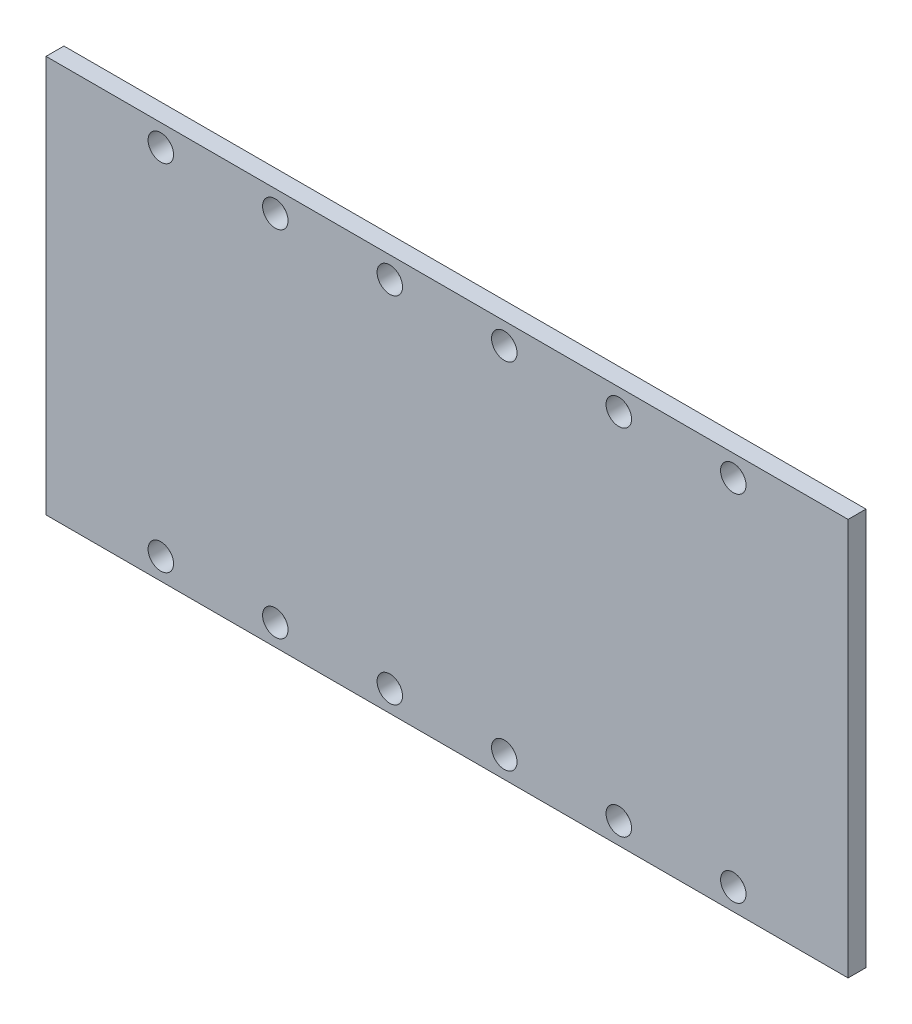
ISO-10303-21;
HEADER;
FILE_DESCRIPTION(('STEP AP214'),'2;1');
FILE_NAME('part.step','',(''),(''),'','','');
FILE_SCHEMA(('AUTOMOTIVE_DESIGN { 1 0 10303 214 1 1 1 1 }'));
ENDSEC;
DATA;
#1=APPLICATION_CONTEXT('core data for automotive mechanical design processes');
#2=APPLICATION_PROTOCOL_DEFINITION('international standard','automotive_design',2000,#1);
#3=PRODUCT_CONTEXT('',#1,'mechanical');
#4=PRODUCT('Part','Part','',(#3));
#5=PRODUCT_RELATED_PRODUCT_CATEGORY('part','',(#4));
#6=PRODUCT_DEFINITION_FORMATION('','',#4);
#7=PRODUCT_DEFINITION_CONTEXT('part definition',#1,'design');
#8=PRODUCT_DEFINITION('design','',#6,#7);
#9=PRODUCT_DEFINITION_SHAPE('','',#8);
#10=(LENGTH_UNIT() NAMED_UNIT(*) SI_UNIT(.MILLI.,.METRE.));
#11=(NAMED_UNIT(*) PLANE_ANGLE_UNIT() SI_UNIT($,.RADIAN.));
#12=(NAMED_UNIT(*) SI_UNIT($,.STERADIAN.) SOLID_ANGLE_UNIT());
#13=UNCERTAINTY_MEASURE_WITH_UNIT(LENGTH_MEASURE(1.E-05),#10,'distance_accuracy_value','');
#14=(GEOMETRIC_REPRESENTATION_CONTEXT(3) GLOBAL_UNCERTAINTY_ASSIGNED_CONTEXT((#13)) GLOBAL_UNIT_ASSIGNED_CONTEXT((#10,
#11,#12)) REPRESENTATION_CONTEXT('',''));
#15=CARTESIAN_POINT('',(0.,0.,0.));
#16=DIRECTION('',(0.,0.,1.));
#17=DIRECTION('',(1.,0.,0.));
#18=AXIS2_PLACEMENT_3D('',#15,#16,#17);
#19=CARTESIAN_POINT('',(35.5854,17.62125,1.5875));
#20=DIRECTION('',(0.,0.,-1.));
#21=DIRECTION('',(-1.,0.,0.));
#22=AXIS2_PLACEMENT_3D('',#19,#20,#21);
#23=PLANE('',#22);
#24=CARTESIAN_POINT('',(5.08,-15.71625,1.5875));
#25=DIRECTION('',(0.,0.,1.));
#26=DIRECTION('',(1.,0.,0.));
#27=AXIS2_PLACEMENT_3D('',#24,#25,#26);
#28=CIRCLE('',#27,1.1303);
#29=CARTESIAN_POINT('',(6.2103,-15.71625,1.5875));
#30=VERTEX_POINT('',#29);
#31=EDGE_CURVE('E169',#30,#30,#28,.T.);
#32=ORIENTED_EDGE('',*,*,#31,.F.);
#33=EDGE_LOOP('',(#32));
#34=FACE_BOUND('',#33,.T.);
#35=CARTESIAN_POINT('',(-15.24,-15.71625,1.5875));
#36=DIRECTION('',(0.,0.,1.));
#37=DIRECTION('',(1.,0.,0.));
#38=AXIS2_PLACEMENT_3D('',#35,#36,#37);
#39=CIRCLE('',#38,1.1303);
#40=CARTESIAN_POINT('',(-14.1097,-15.71625,1.5875));
#41=VERTEX_POINT('',#40);
#42=EDGE_CURVE('E161',#41,#41,#39,.T.);
#43=ORIENTED_EDGE('',*,*,#42,.F.);
#44=EDGE_LOOP('',(#43));
#45=FACE_BOUND('',#44,.T.);
#46=CARTESIAN_POINT('',(-25.4,-15.71625,1.5875));
#47=DIRECTION('',(0.,0.,1.));
#48=DIRECTION('',(1.,0.,0.));
#49=AXIS2_PLACEMENT_3D('',#46,#47,#48);
#50=CIRCLE('',#49,1.1303);
#51=CARTESIAN_POINT('',(-24.2697,-15.71625,1.5875));
#52=VERTEX_POINT('',#51);
#53=EDGE_CURVE('E157',#52,#52,#50,.T.);
#54=ORIENTED_EDGE('',*,*,#53,.F.);
#55=EDGE_LOOP('',(#54));
#56=FACE_BOUND('',#55,.T.);
#57=CARTESIAN_POINT('',(-15.24,15.71625,1.5875));
#58=DIRECTION('',(0.,0.,1.));
#59=DIRECTION('',(1.,0.,0.));
#60=AXIS2_PLACEMENT_3D('',#57,#58,#59);
#61=CIRCLE('',#60,1.1303);
#62=CARTESIAN_POINT('',(-14.1097,15.71625,1.5875));
#63=VERTEX_POINT('',#62);
#64=EDGE_CURVE('E193',#63,#63,#61,.T.);
#65=ORIENTED_EDGE('',*,*,#64,.F.);
#66=EDGE_LOOP('',(#65));
#67=FACE_BOUND('',#66,.T.);
#68=CARTESIAN_POINT('',(-25.4,15.71625,1.5875));
#69=DIRECTION('',(0.,0.,1.));
#70=DIRECTION('',(1.,0.,0.));
#71=AXIS2_PLACEMENT_3D('',#68,#69,#70);
#72=CIRCLE('',#71,1.1303);
#73=CARTESIAN_POINT('',(-24.2697,15.71625,1.5875));
#74=VERTEX_POINT('',#73);
#75=EDGE_CURVE('E197',#74,#74,#72,.T.);
#76=ORIENTED_EDGE('',*,*,#75,.F.);
#77=EDGE_LOOP('',(#76));
#78=FACE_BOUND('',#77,.T.);
#79=DIRECTION('',(0.,1.,0.));
#80=VECTOR('',#79,1.);
#81=CARTESIAN_POINT('',(35.5854,-17.62125,1.5875));
#82=LINE('',#81,#80);
#83=CARTESIAN_POINT('',(35.5854,-17.62125,1.5875));
#84=VERTEX_POINT('',#83);
#85=CARTESIAN_POINT('',(35.5854,17.62125,1.5875));
#86=VERTEX_POINT('',#85);
#87=EDGE_CURVE('E97',#84,#86,#82,.T.);
#88=ORIENTED_EDGE('',*,*,#87,.T.);
#89=DIRECTION('',(-1.,0.,0.));
#90=VECTOR('',#89,1.);
#91=CARTESIAN_POINT('',(-35.5854,17.62125,1.5875));
#92=LINE('',#91,#90);
#93=CARTESIAN_POINT('',(-35.5854,17.62125,1.5875));
#94=VERTEX_POINT('',#93);
#95=EDGE_CURVE('E91',#86,#94,#92,.T.);
#96=ORIENTED_EDGE('',*,*,#95,.T.);
#97=DIRECTION('',(0.,-1.,0.));
#98=VECTOR('',#97,1.);
#99=CARTESIAN_POINT('',(-35.5854,-17.62125,1.5875));
#100=LINE('',#99,#98);
#101=CARTESIAN_POINT('',(-35.5854,-17.62125,1.5875));
#102=VERTEX_POINT('',#101);
#103=EDGE_CURVE('E95',#94,#102,#100,.T.);
#104=ORIENTED_EDGE('',*,*,#103,.T.);
#105=DIRECTION('',(1.,0.,0.));
#106=VECTOR('',#105,1.);
#107=CARTESIAN_POINT('',(-35.5854,-17.62125,1.5875));
#108=LINE('',#107,#106);
#109=EDGE_CURVE('E59',#102,#84,#108,.T.);
#110=ORIENTED_EDGE('',*,*,#109,.T.);
#111=EDGE_LOOP('',(#88,#96,#104,#110));
#112=FACE_BOUND('',#111,.T.);
#113=CARTESIAN_POINT('',(-5.08,15.71625,1.5875));
#114=DIRECTION('',(0.,0.,1.));
#115=DIRECTION('',(1.,0.,0.));
#116=AXIS2_PLACEMENT_3D('',#113,#114,#115);
#117=CIRCLE('',#116,1.1303);
#118=CARTESIAN_POINT('',(-3.9497,15.71625,1.5875));
#119=VERTEX_POINT('',#118);
#120=EDGE_CURVE('E135',#119,#119,#117,.T.);
#121=ORIENTED_EDGE('',*,*,#120,.F.);
#122=EDGE_LOOP('',(#121));
#123=FACE_BOUND('',#122,.T.);
#124=CARTESIAN_POINT('',(5.08,15.71625,1.5875));
#125=DIRECTION('',(0.,0.,1.));
#126=DIRECTION('',(1.,0.,0.));
#127=AXIS2_PLACEMENT_3D('',#124,#125,#126);
#128=CIRCLE('',#127,1.1303);
#129=CARTESIAN_POINT('',(6.2103,15.71625,1.5875));
#130=VERTEX_POINT('',#129);
#131=EDGE_CURVE('E142',#130,#130,#128,.T.);
#132=ORIENTED_EDGE('',*,*,#131,.F.);
#133=EDGE_LOOP('',(#132));
#134=FACE_BOUND('',#133,.T.);
#135=CARTESIAN_POINT('',(15.24,15.71625,1.5875));
#136=DIRECTION('',(0.,0.,1.));
#137=DIRECTION('',(1.,0.,0.));
#138=AXIS2_PLACEMENT_3D('',#135,#136,#137);
#139=CIRCLE('',#138,1.1303);
#140=CARTESIAN_POINT('',(16.3703,15.71625,1.5875));
#141=VERTEX_POINT('',#140);
#142=EDGE_CURVE('E148',#141,#141,#139,.T.);
#143=ORIENTED_EDGE('',*,*,#142,.F.);
#144=EDGE_LOOP('',(#143));
#145=FACE_BOUND('',#144,.T.);
#146=CARTESIAN_POINT('',(25.4,15.71625,1.5875));
#147=DIRECTION('',(0.,0.,1.));
#148=DIRECTION('',(1.,0.,0.));
#149=AXIS2_PLACEMENT_3D('',#146,#147,#148);
#150=CIRCLE('',#149,1.1303);
#151=CARTESIAN_POINT('',(26.5303,15.71625,1.5875));
#152=VERTEX_POINT('',#151);
#153=EDGE_CURVE('E11',#152,#152,#150,.T.);
#154=ORIENTED_EDGE('',*,*,#153,.F.);
#155=EDGE_LOOP('',(#154));
#156=FACE_BOUND('',#155,.T.);
#157=CARTESIAN_POINT('',(-5.08,-15.71625,1.5875));
#158=DIRECTION('',(0.,0.,1.));
#159=DIRECTION('',(1.,0.,0.));
#160=AXIS2_PLACEMENT_3D('',#157,#158,#159);
#161=CIRCLE('',#160,1.1303);
#162=CARTESIAN_POINT('',(-3.9497,-15.71625,1.5875));
#163=VERTEX_POINT('',#162);
#164=EDGE_CURVE('E165',#163,#163,#161,.T.);
#165=ORIENTED_EDGE('',*,*,#164,.F.);
#166=EDGE_LOOP('',(#165));
#167=FACE_BOUND('',#166,.T.);
#168=CARTESIAN_POINT('',(15.24,-15.71625,1.5875));
#169=DIRECTION('',(0.,0.,1.));
#170=DIRECTION('',(1.,0.,0.));
#171=AXIS2_PLACEMENT_3D('',#168,#169,#170);
#172=CIRCLE('',#171,1.1303);
#173=CARTESIAN_POINT('',(16.3703,-15.71625,1.5875));
#174=VERTEX_POINT('',#173);
#175=EDGE_CURVE('E182',#174,#174,#172,.T.);
#176=ORIENTED_EDGE('',*,*,#175,.F.);
#177=EDGE_LOOP('',(#176));
#178=FACE_BOUND('',#177,.T.);
#179=CARTESIAN_POINT('',(25.4,-15.71625,1.5875));
#180=DIRECTION('',(0.,0.,1.));
#181=DIRECTION('',(1.,0.,0.));
#182=AXIS2_PLACEMENT_3D('',#179,#180,#181);
#183=CIRCLE('',#182,1.1303);
#184=CARTESIAN_POINT('',(26.5303,-15.71625,1.5875));
#185=VERTEX_POINT('',#184);
#186=EDGE_CURVE('E205',#185,#185,#183,.T.);
#187=ORIENTED_EDGE('',*,*,#186,.F.);
#188=EDGE_LOOP('',(#187));
#189=FACE_BOUND('',#188,.T.);
#190=ADVANCED_FACE('F38',(#34,#45,#56,#67,#78,#112,#123,#134,#145,#156,#167,#178,#189),#23,.F.);
#191=CARTESIAN_POINT('',(35.5854,-17.62125,1.5875));
#192=DIRECTION('',(-1.,0.,0.));
#193=DIRECTION('',(0.,0.,1.));
#194=AXIS2_PLACEMENT_3D('',#191,#192,#193);
#195=PLANE('',#194);
#196=DIRECTION('',(0.,1.,0.));
#197=VECTOR('',#196,1.);
#198=CARTESIAN_POINT('',(35.5854,-17.62125,0.));
#199=LINE('',#198,#197);
#200=CARTESIAN_POINT('',(35.5854,-17.62125,0.));
#201=VERTEX_POINT('',#200);
#202=CARTESIAN_POINT('',(35.5854,17.62125,0.));
#203=VERTEX_POINT('',#202);
#204=EDGE_CURVE('E116',#201,#203,#199,.T.);
#205=ORIENTED_EDGE('',*,*,#204,.T.);
#206=DIRECTION('',(0.,0.,-1.));
#207=VECTOR('',#206,1.);
#208=CARTESIAN_POINT('',(35.5854,17.62125,1.5875));
#209=LINE('',#208,#207);
#210=EDGE_CURVE('E105',#86,#203,#209,.T.);
#211=ORIENTED_EDGE('',*,*,#210,.F.);
#212=ORIENTED_EDGE('',*,*,#87,.F.);
#213=DIRECTION('',(0.,0.,-1.));
#214=VECTOR('',#213,1.);
#215=CARTESIAN_POINT('',(35.5854,-17.62125,1.5875));
#216=LINE('',#215,#214);
#217=EDGE_CURVE('E112',#84,#201,#216,.T.);
#218=ORIENTED_EDGE('',*,*,#217,.T.);
#219=EDGE_LOOP('',(#205,#211,#212,#218));
#220=FACE_BOUND('',#219,.T.);
#221=ADVANCED_FACE('F218',(#220),#195,.F.);
#222=CARTESIAN_POINT('',(-35.5854,17.62125,1.5875));
#223=DIRECTION('',(0.,-1.,0.));
#224=DIRECTION('',(0.,0.,-1.));
#225=AXIS2_PLACEMENT_3D('',#222,#223,#224);
#226=PLANE('',#225);
#227=DIRECTION('',(-1.,0.,0.));
#228=VECTOR('',#227,1.);
#229=CARTESIAN_POINT('',(-35.5854,17.62125,0.));
#230=LINE('',#229,#228);
#231=CARTESIAN_POINT('',(-35.5854,17.62125,0.));
#232=VERTEX_POINT('',#231);
#233=EDGE_CURVE('E103',#203,#232,#230,.T.);
#234=ORIENTED_EDGE('',*,*,#233,.T.);
#235=DIRECTION('',(0.,0.,-1.));
#236=VECTOR('',#235,1.);
#237=CARTESIAN_POINT('',(-35.5854,17.62125,1.5875));
#238=LINE('',#237,#236);
#239=EDGE_CURVE('E101',#94,#232,#238,.T.);
#240=ORIENTED_EDGE('',*,*,#239,.F.);
#241=ORIENTED_EDGE('',*,*,#95,.F.);
#242=ORIENTED_EDGE('',*,*,#210,.T.);
#243=EDGE_LOOP('',(#234,#240,#241,#242));
#244=FACE_BOUND('',#243,.T.);
#245=ADVANCED_FACE('F102',(#244),#226,.F.);
#246=CARTESIAN_POINT('',(-35.5854,-17.62125,1.5875));
#247=DIRECTION('',(1.,0.,0.));
#248=DIRECTION('',(0.,0.,-1.));
#249=AXIS2_PLACEMENT_3D('',#246,#247,#248);
#250=PLANE('',#249);
#251=DIRECTION('',(0.,-1.,0.));
#252=VECTOR('',#251,1.);
#253=CARTESIAN_POINT('',(-35.5854,-17.62125,0.));
#254=LINE('',#253,#252);
#255=CARTESIAN_POINT('',(-35.5854,-17.62125,0.));
#256=VERTEX_POINT('',#255);
#257=EDGE_CURVE('E77',#232,#256,#254,.T.);
#258=ORIENTED_EDGE('',*,*,#257,.T.);
#259=DIRECTION('',(0.,0.,-1.));
#260=VECTOR('',#259,1.);
#261=CARTESIAN_POINT('',(-35.5854,-17.62125,1.5875));
#262=LINE('',#261,#260);
#263=EDGE_CURVE('E106',#102,#256,#262,.T.);
#264=ORIENTED_EDGE('',*,*,#263,.F.);
#265=ORIENTED_EDGE('',*,*,#103,.F.);
#266=ORIENTED_EDGE('',*,*,#239,.T.);
#267=EDGE_LOOP('',(#258,#264,#265,#266));
#268=FACE_BOUND('',#267,.T.);
#269=ADVANCED_FACE('F108',(#268),#250,.F.);
#270=CARTESIAN_POINT('',(-35.5854,-17.62125,1.5875));
#271=DIRECTION('',(0.,1.,0.));
#272=DIRECTION('',(0.,0.,1.));
#273=AXIS2_PLACEMENT_3D('',#270,#271,#272);
#274=PLANE('',#273);
#275=DIRECTION('',(1.,0.,0.));
#276=VECTOR('',#275,1.);
#277=CARTESIAN_POINT('',(-35.5854,-17.62125,0.));
#278=LINE('',#277,#276);
#279=EDGE_CURVE('E83',#256,#201,#278,.T.);
#280=ORIENTED_EDGE('',*,*,#279,.T.);
#281=ORIENTED_EDGE('',*,*,#217,.F.);
#282=ORIENTED_EDGE('',*,*,#109,.F.);
#283=ORIENTED_EDGE('',*,*,#263,.T.);
#284=EDGE_LOOP('',(#280,#281,#282,#283));
#285=FACE_BOUND('',#284,.T.);
#286=ADVANCED_FACE('F259',(#285),#274,.F.);
#287=CARTESIAN_POINT('',(35.5854,17.62125,0.));
#288=DIRECTION('',(0.,0.,-1.));
#289=DIRECTION('',(-1.,0.,0.));
#290=AXIS2_PLACEMENT_3D('',#287,#288,#289);
#291=PLANE('',#290);
#292=CARTESIAN_POINT('',(25.4,-15.71625,0.));
#293=DIRECTION('',(0.,0.,-1.));
#294=DIRECTION('',(-1.,0.,0.));
#295=AXIS2_PLACEMENT_3D('',#292,#293,#294);
#296=CIRCLE('',#295,1.1303);
#297=CARTESIAN_POINT('',(24.2697,-15.71625,0.));
#298=VERTEX_POINT('',#297);
#299=EDGE_CURVE('E42',#298,#298,#296,.T.);
#300=ORIENTED_EDGE('',*,*,#299,.F.);
#301=EDGE_LOOP('',(#300));
#302=FACE_BOUND('',#301,.T.);
#303=CARTESIAN_POINT('',(15.24,-15.71625,0.));
#304=DIRECTION('',(0.,0.,-1.));
#305=DIRECTION('',(-1.,0.,0.));
#306=AXIS2_PLACEMENT_3D('',#303,#304,#305);
#307=CIRCLE('',#306,1.1303);
#308=CARTESIAN_POINT('',(14.1097,-15.71625,0.));
#309=VERTEX_POINT('',#308);
#310=EDGE_CURVE('E177',#309,#309,#307,.T.);
#311=ORIENTED_EDGE('',*,*,#310,.F.);
#312=EDGE_LOOP('',(#311));
#313=FACE_BOUND('',#312,.T.);
#314=CARTESIAN_POINT('',(5.08,-15.71625,0.));
#315=DIRECTION('',(0.,0.,-1.));
#316=DIRECTION('',(-1.,0.,0.));
#317=AXIS2_PLACEMENT_3D('',#314,#315,#316);
#318=CIRCLE('',#317,1.1303);
#319=CARTESIAN_POINT('',(3.9497,-15.71625,0.));
#320=VERTEX_POINT('',#319);
#321=EDGE_CURVE('E166',#320,#320,#318,.T.);
#322=ORIENTED_EDGE('',*,*,#321,.F.);
#323=EDGE_LOOP('',(#322));
#324=FACE_BOUND('',#323,.T.);
#325=CARTESIAN_POINT('',(-5.08,-15.71625,0.));
#326=DIRECTION('',(0.,0.,-1.));
#327=DIRECTION('',(-1.,0.,0.));
#328=AXIS2_PLACEMENT_3D('',#325,#326,#327);
#329=CIRCLE('',#328,1.1303);
#330=CARTESIAN_POINT('',(-6.2103,-15.71625,0.));
#331=VERTEX_POINT('',#330);
#332=EDGE_CURVE('E162',#331,#331,#329,.T.);
#333=ORIENTED_EDGE('',*,*,#332,.F.);
#334=EDGE_LOOP('',(#333));
#335=FACE_BOUND('',#334,.T.);
#336=CARTESIAN_POINT('',(-15.24,-15.71625,0.));
#337=DIRECTION('',(0.,0.,-1.));
#338=DIRECTION('',(-1.,0.,0.));
#339=AXIS2_PLACEMENT_3D('',#336,#337,#338);
#340=CIRCLE('',#339,1.1303);
#341=CARTESIAN_POINT('',(-16.3703,-15.71625,0.));
#342=VERTEX_POINT('',#341);
#343=EDGE_CURVE('E158',#342,#342,#340,.T.);
#344=ORIENTED_EDGE('',*,*,#343,.F.);
#345=EDGE_LOOP('',(#344));
#346=FACE_BOUND('',#345,.T.);
#347=CARTESIAN_POINT('',(-25.4,-15.71625,0.));
#348=DIRECTION('',(0.,0.,-1.));
#349=DIRECTION('',(-1.,0.,0.));
#350=AXIS2_PLACEMENT_3D('',#347,#348,#349);
#351=CIRCLE('',#350,1.1303);
#352=CARTESIAN_POINT('',(-26.5303,-15.71625,0.));
#353=VERTEX_POINT('',#352);
#354=EDGE_CURVE('E153',#353,#353,#351,.T.);
#355=ORIENTED_EDGE('',*,*,#354,.F.);
#356=EDGE_LOOP('',(#355));
#357=FACE_BOUND('',#356,.T.);
#358=CARTESIAN_POINT('',(-15.24,15.71625,0.));
#359=DIRECTION('',(0.,0.,-1.));
#360=DIRECTION('',(-1.,0.,0.));
#361=AXIS2_PLACEMENT_3D('',#358,#359,#360);
#362=CIRCLE('',#361,1.1303);
#363=CARTESIAN_POINT('',(-16.3703,15.71625,0.));
#364=VERTEX_POINT('',#363);
#365=EDGE_CURVE('E156',#364,#364,#362,.T.);
#366=ORIENTED_EDGE('',*,*,#365,.F.);
#367=EDGE_LOOP('',(#366));
#368=FACE_BOUND('',#367,.T.);
#369=CARTESIAN_POINT('',(-25.4,15.71625,0.));
#370=DIRECTION('',(0.,0.,-1.));
#371=DIRECTION('',(-1.,0.,0.));
#372=AXIS2_PLACEMENT_3D('',#369,#370,#371);
#373=CIRCLE('',#372,1.1303);
#374=CARTESIAN_POINT('',(-26.5303,15.71625,0.));
#375=VERTEX_POINT('',#374);
#376=EDGE_CURVE('E120',#375,#375,#373,.T.);
#377=ORIENTED_EDGE('',*,*,#376,.F.);
#378=EDGE_LOOP('',(#377));
#379=FACE_BOUND('',#378,.T.);
#380=ORIENTED_EDGE('',*,*,#204,.F.);
#381=ORIENTED_EDGE('',*,*,#279,.F.);
#382=ORIENTED_EDGE('',*,*,#257,.F.);
#383=ORIENTED_EDGE('',*,*,#233,.F.);
#384=EDGE_LOOP('',(#380,#381,#382,#383));
#385=FACE_BOUND('',#384,.T.);
#386=CARTESIAN_POINT('',(-5.08,15.71625,0.));
#387=DIRECTION('',(0.,0.,-1.));
#388=DIRECTION('',(-1.,0.,0.));
#389=AXIS2_PLACEMENT_3D('',#386,#387,#388);
#390=CIRCLE('',#389,1.1303);
#391=CARTESIAN_POINT('',(-6.2103,15.71625,0.));
#392=VERTEX_POINT('',#391);
#393=EDGE_CURVE('E131',#392,#392,#390,.T.);
#394=ORIENTED_EDGE('',*,*,#393,.F.);
#395=EDGE_LOOP('',(#394));
#396=FACE_BOUND('',#395,.T.);
#397=CARTESIAN_POINT('',(5.08,15.71625,0.));
#398=DIRECTION('',(0.,0.,-1.));
#399=DIRECTION('',(-1.,0.,0.));
#400=AXIS2_PLACEMENT_3D('',#397,#398,#399);
#401=CIRCLE('',#400,1.1303);
#402=CARTESIAN_POINT('',(3.9497,15.71625,0.));
#403=VERTEX_POINT('',#402);
#404=EDGE_CURVE('E138',#403,#403,#401,.T.);
#405=ORIENTED_EDGE('',*,*,#404,.F.);
#406=EDGE_LOOP('',(#405));
#407=FACE_BOUND('',#406,.T.);
#408=CARTESIAN_POINT('',(15.24,15.71625,0.));
#409=DIRECTION('',(0.,0.,-1.));
#410=DIRECTION('',(-1.,0.,0.));
#411=AXIS2_PLACEMENT_3D('',#408,#409,#410);
#412=CIRCLE('',#411,1.1303);
#413=CARTESIAN_POINT('',(14.1097,15.71625,0.));
#414=VERTEX_POINT('',#413);
#415=EDGE_CURVE('E145',#414,#414,#412,.T.);
#416=ORIENTED_EDGE('',*,*,#415,.F.);
#417=EDGE_LOOP('',(#416));
#418=FACE_BOUND('',#417,.T.);
#419=CARTESIAN_POINT('',(25.4,15.71625,0.));
#420=DIRECTION('',(0.,0.,-1.));
#421=DIRECTION('',(-1.,0.,0.));
#422=AXIS2_PLACEMENT_3D('',#419,#420,#421);
#423=CIRCLE('',#422,1.1303);
#424=CARTESIAN_POINT('',(24.2697,15.71625,0.));
#425=VERTEX_POINT('',#424);
#426=EDGE_CURVE('E48',#425,#425,#423,.T.);
#427=ORIENTED_EDGE('',*,*,#426,.F.);
#428=EDGE_LOOP('',(#427));
#429=FACE_BOUND('',#428,.T.);
#430=ADVANCED_FACE('F254',(#302,#313,#324,#335,#346,#357,#368,#379,#385,#396,#407,#418,#429),
#291,.T.);
#431=CARTESIAN_POINT('',(-25.4,15.71625,1.5875));
#432=DIRECTION('',(0.,0.,1.));
#433=DIRECTION('',(1.,0.,0.));
#434=AXIS2_PLACEMENT_3D('',#431,#432,#433);
#435=CYLINDRICAL_SURFACE('',#434,1.1303);
#436=ORIENTED_EDGE('',*,*,#376,.T.);
#437=EDGE_LOOP('',(#436));
#438=FACE_BOUND('',#437,.T.);
#439=ORIENTED_EDGE('',*,*,#75,.T.);
#440=EDGE_LOOP('',(#439));
#441=FACE_BOUND('',#440,.T.);
#442=ADVANCED_FACE('F251',(#438,#441),#435,.F.);
#443=CARTESIAN_POINT('',(-15.24,15.71625,1.5875));
#444=DIRECTION('',(0.,0.,1.));
#445=DIRECTION('',(1.,0.,0.));
#446=AXIS2_PLACEMENT_3D('',#443,#444,#445);
#447=CYLINDRICAL_SURFACE('',#446,1.1303);
#448=ORIENTED_EDGE('',*,*,#365,.T.);
#449=EDGE_LOOP('',(#448));
#450=FACE_BOUND('',#449,.T.);
#451=ORIENTED_EDGE('',*,*,#64,.T.);
#452=EDGE_LOOP('',(#451));
#453=FACE_BOUND('',#452,.T.);
#454=ADVANCED_FACE('F247',(#450,#453),#447,.F.);
#455=CARTESIAN_POINT('',(-5.08,15.71625,1.5875));
#456=DIRECTION('',(0.,0.,1.));
#457=DIRECTION('',(1.,0.,0.));
#458=AXIS2_PLACEMENT_3D('',#455,#456,#457);
#459=CYLINDRICAL_SURFACE('',#458,1.1303);
#460=ORIENTED_EDGE('',*,*,#393,.T.);
#461=EDGE_LOOP('',(#460));
#462=FACE_BOUND('',#461,.T.);
#463=ORIENTED_EDGE('',*,*,#120,.T.);
#464=EDGE_LOOP('',(#463));
#465=FACE_BOUND('',#464,.T.);
#466=ADVANCED_FACE('F250',(#462,#465),#459,.F.);
#467=CARTESIAN_POINT('',(5.08,15.71625,1.5875));
#468=DIRECTION('',(0.,0.,1.));
#469=DIRECTION('',(1.,0.,0.));
#470=AXIS2_PLACEMENT_3D('',#467,#468,#469);
#471=CYLINDRICAL_SURFACE('',#470,1.1303);
#472=ORIENTED_EDGE('',*,*,#404,.T.);
#473=EDGE_LOOP('',(#472));
#474=FACE_BOUND('',#473,.T.);
#475=ORIENTED_EDGE('',*,*,#131,.T.);
#476=EDGE_LOOP('',(#475));
#477=FACE_BOUND('',#476,.T.);
#478=ADVANCED_FACE('F272',(#474,#477),#471,.F.);
#479=CARTESIAN_POINT('',(15.24,15.71625,1.5875));
#480=DIRECTION('',(0.,0.,1.));
#481=DIRECTION('',(1.,0.,0.));
#482=AXIS2_PLACEMENT_3D('',#479,#480,#481);
#483=CYLINDRICAL_SURFACE('',#482,1.1303);
#484=ORIENTED_EDGE('',*,*,#415,.T.);
#485=EDGE_LOOP('',(#484));
#486=FACE_BOUND('',#485,.T.);
#487=ORIENTED_EDGE('',*,*,#142,.T.);
#488=EDGE_LOOP('',(#487));
#489=FACE_BOUND('',#488,.T.);
#490=ADVANCED_FACE('F275',(#486,#489),#483,.F.);
#491=CARTESIAN_POINT('',(25.4,15.71625,1.5875));
#492=DIRECTION('',(0.,0.,1.));
#493=DIRECTION('',(1.,0.,0.));
#494=AXIS2_PLACEMENT_3D('',#491,#492,#493);
#495=CYLINDRICAL_SURFACE('',#494,1.1303);
#496=ORIENTED_EDGE('',*,*,#426,.T.);
#497=EDGE_LOOP('',(#496));
#498=FACE_BOUND('',#497,.T.);
#499=ORIENTED_EDGE('',*,*,#153,.T.);
#500=EDGE_LOOP('',(#499));
#501=FACE_BOUND('',#500,.T.);
#502=ADVANCED_FACE('F40',(#498,#501),#495,.F.);
#503=CARTESIAN_POINT('',(-25.4,-15.71625,1.5875));
#504=DIRECTION('',(0.,0.,1.));
#505=DIRECTION('',(1.,0.,0.));
#506=AXIS2_PLACEMENT_3D('',#503,#504,#505);
#507=CYLINDRICAL_SURFACE('',#506,1.1303);
#508=ORIENTED_EDGE('',*,*,#354,.T.);
#509=EDGE_LOOP('',(#508));
#510=FACE_BOUND('',#509,.T.);
#511=ORIENTED_EDGE('',*,*,#53,.T.);
#512=EDGE_LOOP('',(#511));
#513=FACE_BOUND('',#512,.T.);
#514=ADVANCED_FACE('F242',(#510,#513),#507,.F.);
#515=CARTESIAN_POINT('',(-15.24,-15.71625,1.5875));
#516=DIRECTION('',(0.,0.,1.));
#517=DIRECTION('',(1.,0.,0.));
#518=AXIS2_PLACEMENT_3D('',#515,#516,#517);
#519=CYLINDRICAL_SURFACE('',#518,1.1303);
#520=ORIENTED_EDGE('',*,*,#343,.T.);
#521=EDGE_LOOP('',(#520));
#522=FACE_BOUND('',#521,.T.);
#523=ORIENTED_EDGE('',*,*,#42,.T.);
#524=EDGE_LOOP('',(#523));
#525=FACE_BOUND('',#524,.T.);
#526=ADVANCED_FACE('F238',(#522,#525),#519,.F.);
#527=CARTESIAN_POINT('',(-5.08,-15.71625,1.5875));
#528=DIRECTION('',(0.,0.,1.));
#529=DIRECTION('',(1.,0.,0.));
#530=AXIS2_PLACEMENT_3D('',#527,#528,#529);
#531=CYLINDRICAL_SURFACE('',#530,1.1303);
#532=ORIENTED_EDGE('',*,*,#332,.T.);
#533=EDGE_LOOP('',(#532));
#534=FACE_BOUND('',#533,.T.);
#535=ORIENTED_EDGE('',*,*,#164,.T.);
#536=EDGE_LOOP('',(#535));
#537=FACE_BOUND('',#536,.T.);
#538=ADVANCED_FACE('F235',(#534,#537),#531,.F.);
#539=CARTESIAN_POINT('',(5.08,-15.71625,1.5875));
#540=DIRECTION('',(0.,0.,1.));
#541=DIRECTION('',(1.,0.,0.));
#542=AXIS2_PLACEMENT_3D('',#539,#540,#541);
#543=CYLINDRICAL_SURFACE('',#542,1.1303);
#544=ORIENTED_EDGE('',*,*,#321,.T.);
#545=EDGE_LOOP('',(#544));
#546=FACE_BOUND('',#545,.T.);
#547=ORIENTED_EDGE('',*,*,#31,.T.);
#548=EDGE_LOOP('',(#547));
#549=FACE_BOUND('',#548,.T.);
#550=ADVANCED_FACE('F229',(#546,#549),#543,.F.);
#551=CARTESIAN_POINT('',(15.24,-15.71625,1.5875));
#552=DIRECTION('',(0.,0.,1.));
#553=DIRECTION('',(1.,0.,0.));
#554=AXIS2_PLACEMENT_3D('',#551,#552,#553);
#555=CYLINDRICAL_SURFACE('',#554,1.1303);
#556=ORIENTED_EDGE('',*,*,#310,.T.);
#557=EDGE_LOOP('',(#556));
#558=FACE_BOUND('',#557,.T.);
#559=ORIENTED_EDGE('',*,*,#175,.T.);
#560=EDGE_LOOP('',(#559));
#561=FACE_BOUND('',#560,.T.);
#562=ADVANCED_FACE('F214',(#558,#561),#555,.F.);
#563=CARTESIAN_POINT('',(25.4,-15.71625,1.5875));
#564=DIRECTION('',(0.,0.,1.));
#565=DIRECTION('',(1.,0.,0.));
#566=AXIS2_PLACEMENT_3D('',#563,#564,#565);
#567=CYLINDRICAL_SURFACE('',#566,1.1303);
#568=ORIENTED_EDGE('',*,*,#299,.T.);
#569=EDGE_LOOP('',(#568));
#570=FACE_BOUND('',#569,.T.);
#571=ORIENTED_EDGE('',*,*,#186,.T.);
#572=EDGE_LOOP('',(#571));
#573=FACE_BOUND('',#572,.T.);
#574=ADVANCED_FACE('F223',(#570,#573),#567,.F.);
#575=CLOSED_SHELL('',(#190,#221,#245,#269,#286,#430,#442,#454,#466,#478,#490,#502,#514,#526,
#538,#550,#562,#574));
#576=MANIFOLD_SOLID_BREP('B2',#575);
#577=ADVANCED_BREP_SHAPE_REPRESENTATION('',(#18,#576),#14);
#578=SHAPE_DEFINITION_REPRESENTATION(#9,#577);
ENDSEC;
END-ISO-10303-21;
